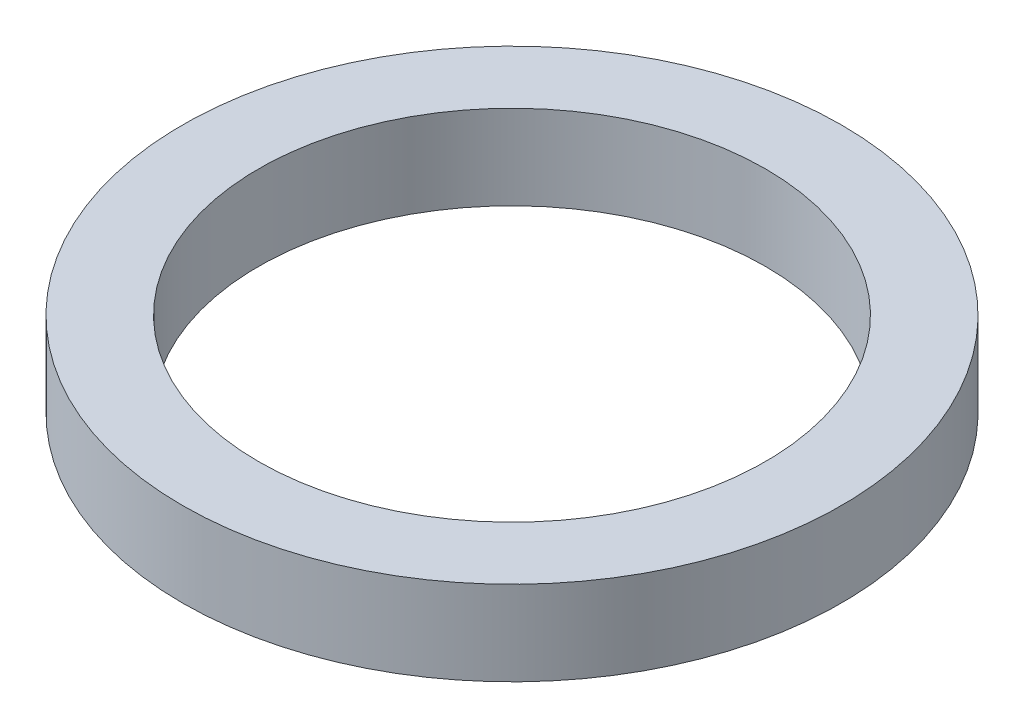
ISO-10303-21;
HEADER;
FILE_DESCRIPTION(('STEP AP214'),'2;1');
FILE_NAME('part.step','',(''),(''),'','','');
FILE_SCHEMA(('AUTOMOTIVE_DESIGN { 1 0 10303 214 1 1 1 1 }'));
ENDSEC;
DATA;
#1=APPLICATION_CONTEXT('core data for automotive mechanical design processes');
#2=APPLICATION_PROTOCOL_DEFINITION('international standard','automotive_design',2000,#1);
#3=PRODUCT_CONTEXT('',#1,'mechanical');
#4=PRODUCT('Part','Part','',(#3));
#5=PRODUCT_RELATED_PRODUCT_CATEGORY('part','',(#4));
#6=PRODUCT_DEFINITION_FORMATION('','',#4);
#7=PRODUCT_DEFINITION_CONTEXT('part definition',#1,'design');
#8=PRODUCT_DEFINITION('design','',#6,#7);
#9=PRODUCT_DEFINITION_SHAPE('','',#8);
#10=(LENGTH_UNIT() NAMED_UNIT(*) SI_UNIT(.MILLI.,.METRE.));
#11=(NAMED_UNIT(*) PLANE_ANGLE_UNIT() SI_UNIT($,.RADIAN.));
#12=(NAMED_UNIT(*) SI_UNIT($,.STERADIAN.) SOLID_ANGLE_UNIT());
#13=UNCERTAINTY_MEASURE_WITH_UNIT(LENGTH_MEASURE(1.E-05),#10,'distance_accuracy_value','');
#14=(GEOMETRIC_REPRESENTATION_CONTEXT(3) GLOBAL_UNCERTAINTY_ASSIGNED_CONTEXT((#13)) GLOBAL_UNIT_ASSIGNED_CONTEXT((#10,
#11,#12)) REPRESENTATION_CONTEXT('',''));
#15=CARTESIAN_POINT('',(0.,0.,0.));
#16=DIRECTION('',(0.,0.,1.));
#17=DIRECTION('',(1.,0.,0.));
#18=AXIS2_PLACEMENT_3D('',#15,#16,#17);
#19=CARTESIAN_POINT('',(0.,5.,0.));
#20=DIRECTION('',(0.,1.,0.));
#21=DIRECTION('',(0.,0.,1.));
#22=AXIS2_PLACEMENT_3D('',#19,#20,#21);
#23=PLANE('',#22);
#24=CARTESIAN_POINT('',(0.,5.,0.));
#25=DIRECTION('',(0.,1.,0.));
#26=DIRECTION('',(0.,0.,1.));
#27=AXIS2_PLACEMENT_3D('',#24,#25,#26);
#28=CIRCLE('',#27,39.);
#29=CARTESIAN_POINT('',(0.,5.,39.));
#30=VERTEX_POINT('',#29);
#31=EDGE_CURVE('E10',#30,#30,#28,.T.);
#32=ORIENTED_EDGE('',*,*,#31,.T.);
#33=EDGE_LOOP('',(#32));
#34=FACE_BOUND('',#33,.T.);
#35=CARTESIAN_POINT('',(0.,5.,0.));
#36=DIRECTION('',(0.,1.,0.));
#37=DIRECTION('',(0.,0.,1.));
#38=AXIS2_PLACEMENT_3D('',#35,#36,#37);
#39=CIRCLE('',#38,30.);
#40=CARTESIAN_POINT('',(0.,5.,30.));
#41=VERTEX_POINT('',#40);
#42=EDGE_CURVE('E50',#41,#41,#39,.T.);
#43=ORIENTED_EDGE('',*,*,#42,.F.);
#44=EDGE_LOOP('',(#43));
#45=FACE_BOUND('',#44,.T.);
#46=ADVANCED_FACE('F39',(#34,#45),#23,.T.);
#47=CARTESIAN_POINT('',(0.,-5.,0.));
#48=DIRECTION('',(0.,1.,0.));
#49=DIRECTION('',(0.,0.,1.));
#50=AXIS2_PLACEMENT_3D('',#47,#48,#49);
#51=PLANE('',#50);
#52=CARTESIAN_POINT('',(0.,-5.,0.));
#53=DIRECTION('',(0.,1.,0.));
#54=DIRECTION('',(0.,0.,1.));
#55=AXIS2_PLACEMENT_3D('',#52,#53,#54);
#56=CIRCLE('',#55,39.);
#57=CARTESIAN_POINT('',(0.,-5.,39.));
#58=VERTEX_POINT('',#57);
#59=EDGE_CURVE('E43',#58,#58,#56,.T.);
#60=ORIENTED_EDGE('',*,*,#59,.F.);
#61=EDGE_LOOP('',(#60));
#62=FACE_BOUND('',#61,.T.);
#63=CARTESIAN_POINT('',(0.,-5.,0.));
#64=DIRECTION('',(0.,1.,0.));
#65=DIRECTION('',(0.,0.,1.));
#66=AXIS2_PLACEMENT_3D('',#63,#64,#65);
#67=CIRCLE('',#66,30.);
#68=CARTESIAN_POINT('',(0.,-5.,30.));
#69=VERTEX_POINT('',#68);
#70=EDGE_CURVE('E52',#69,#69,#67,.T.);
#71=ORIENTED_EDGE('',*,*,#70,.T.);
#72=EDGE_LOOP('',(#71));
#73=FACE_BOUND('',#72,.T.);
#74=ADVANCED_FACE('F62',(#62,#73),#51,.F.);
#75=CARTESIAN_POINT('',(0.,5.,0.));
#76=DIRECTION('',(0.,-1.,0.));
#77=DIRECTION('',(0.,0.,-1.));
#78=AXIS2_PLACEMENT_3D('',#75,#76,#77);
#79=CYLINDRICAL_SURFACE('',#78,39.);
#80=ORIENTED_EDGE('',*,*,#31,.F.);
#81=EDGE_LOOP('',(#80));
#82=FACE_BOUND('',#81,.T.);
#83=ORIENTED_EDGE('',*,*,#59,.T.);
#84=EDGE_LOOP('',(#83));
#85=FACE_BOUND('',#84,.T.);
#86=ADVANCED_FACE('F41',(#82,#85),#79,.T.);
#87=CARTESIAN_POINT('',(0.,5.,0.));
#88=DIRECTION('',(0.,-1.,0.));
#89=DIRECTION('',(0.,0.,-1.));
#90=AXIS2_PLACEMENT_3D('',#87,#88,#89);
#91=CYLINDRICAL_SURFACE('',#90,30.);
#92=ORIENTED_EDGE('',*,*,#42,.T.);
#93=EDGE_LOOP('',(#92));
#94=FACE_BOUND('',#93,.T.);
#95=ORIENTED_EDGE('',*,*,#70,.F.);
#96=EDGE_LOOP('',(#95));
#97=FACE_BOUND('',#96,.T.);
#98=ADVANCED_FACE('F58',(#94,#97),#91,.F.);
#99=CLOSED_SHELL('',(#46,#74,#86,#98));
#100=MANIFOLD_SOLID_BREP('B2',#99);
#101=ADVANCED_BREP_SHAPE_REPRESENTATION('',(#18,#100),#14);
#102=SHAPE_DEFINITION_REPRESENTATION(#9,#101);
ENDSEC;
END-ISO-10303-21;
